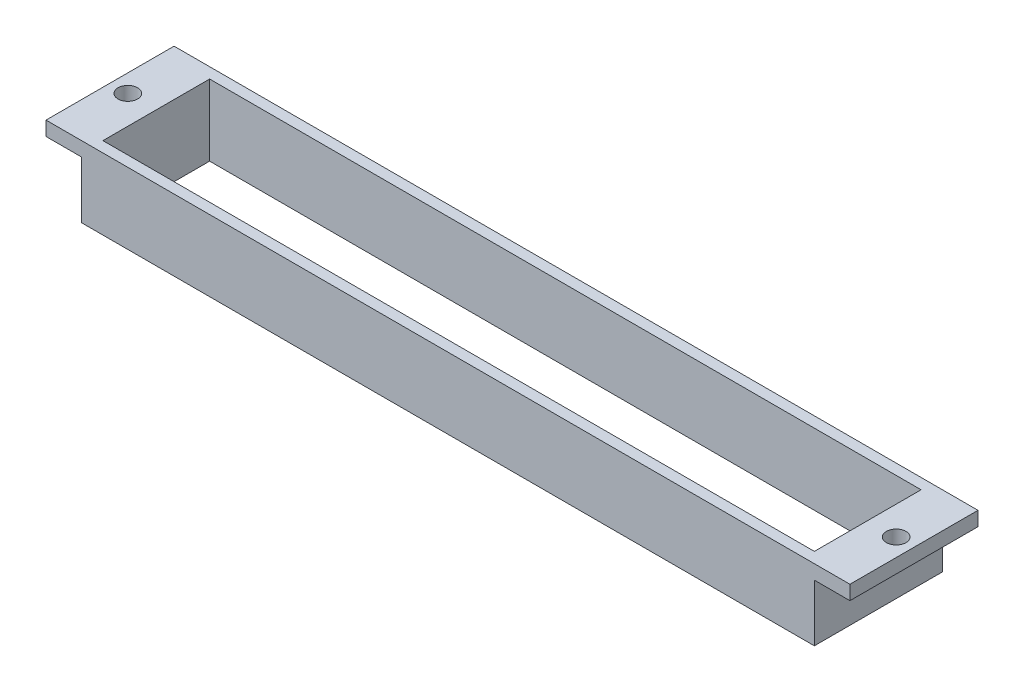
ISO-10303-21;
HEADER;
FILE_DESCRIPTION(('STEP AP214'),'2;1');
FILE_NAME('part.step','',(''),(''),'','','');
FILE_SCHEMA(('AUTOMOTIVE_DESIGN { 1 0 10303 214 1 1 1 1 }'));
ENDSEC;
DATA;
#1=APPLICATION_CONTEXT('core data for automotive mechanical design processes');
#2=APPLICATION_PROTOCOL_DEFINITION('international standard','automotive_design',2000,#1);
#3=PRODUCT_CONTEXT('',#1,'mechanical');
#4=PRODUCT('Part','Part','',(#3));
#5=PRODUCT_RELATED_PRODUCT_CATEGORY('part','',(#4));
#6=PRODUCT_DEFINITION_FORMATION('','',#4);
#7=PRODUCT_DEFINITION_CONTEXT('part definition',#1,'design');
#8=PRODUCT_DEFINITION('design','',#6,#7);
#9=PRODUCT_DEFINITION_SHAPE('','',#8);
#10=(LENGTH_UNIT() NAMED_UNIT(*) SI_UNIT(.MILLI.,.METRE.));
#11=(NAMED_UNIT(*) PLANE_ANGLE_UNIT() SI_UNIT($,.RADIAN.));
#12=(NAMED_UNIT(*) SI_UNIT($,.STERADIAN.) SOLID_ANGLE_UNIT());
#13=UNCERTAINTY_MEASURE_WITH_UNIT(LENGTH_MEASURE(1.E-05),#10,'distance_accuracy_value','');
#14=(GEOMETRIC_REPRESENTATION_CONTEXT(3) GLOBAL_UNCERTAINTY_ASSIGNED_CONTEXT((#13)) GLOBAL_UNIT_ASSIGNED_CONTEXT((#10,
#11,#12)) REPRESENTATION_CONTEXT('',''));
#15=CARTESIAN_POINT('',(0.,0.,0.));
#16=DIRECTION('',(0.,0.,1.));
#17=DIRECTION('',(1.,0.,0.));
#18=AXIS2_PLACEMENT_3D('',#15,#16,#17);
#19=CARTESIAN_POINT('',(0.,20.,0.));
#20=DIRECTION('',(0.,1.,0.));
#21=DIRECTION('',(0.,0.,1.));
#22=AXIS2_PLACEMENT_3D('',#19,#20,#21);
#23=PLANE('',#22);
#24=CARTESIAN_POINT('',(-108.,20.,0.));
#25=DIRECTION('',(0.,1.,0.));
#26=DIRECTION('',(0.,0.,1.));
#27=AXIS2_PLACEMENT_3D('',#24,#25,#26);
#28=CIRCLE('',#27,2.75000000000001);
#29=CARTESIAN_POINT('',(-108.,20.,2.75000000000001));
#30=VERTEX_POINT('',#29);
#31=EDGE_CURVE('E379',#30,#30,#28,.T.);
#32=ORIENTED_EDGE('',*,*,#31,.F.);
#33=EDGE_LOOP('',(#32));
#34=FACE_BOUND('',#33,.T.);
#35=CARTESIAN_POINT('',(108.,20.,0.));
#36=DIRECTION('',(0.,1.,0.));
#37=DIRECTION('',(0.,0.,1.));
#38=AXIS2_PLACEMENT_3D('',#35,#36,#37);
#39=CIRCLE('',#38,2.75000000000001);
#40=CARTESIAN_POINT('',(108.,20.,2.75000000000001));
#41=VERTEX_POINT('',#40);
#42=EDGE_CURVE('E151',#41,#41,#39,.T.);
#43=ORIENTED_EDGE('',*,*,#42,.F.);
#44=EDGE_LOOP('',(#43));
#45=FACE_BOUND('',#44,.T.);
#46=DIRECTION('',(-1.,0.,0.));
#47=VECTOR('',#46,1.);
#48=CARTESIAN_POINT('',(-103.,20.,-18.));
#49=LINE('',#48,#47);
#50=CARTESIAN_POINT('',(113.,20.,-18.));
#51=VERTEX_POINT('',#50);
#52=CARTESIAN_POINT('',(-113.,20.,-18.));
#53=VERTEX_POINT('',#52);
#54=EDGE_CURVE('E206',#51,#53,#49,.T.);
#55=ORIENTED_EDGE('',*,*,#54,.T.);
#56=DIRECTION('',(0.,0.,1.));
#57=VECTOR('',#56,1.);
#58=CARTESIAN_POINT('',(-113.,20.,-18.));
#59=LINE('',#58,#57);
#60=CARTESIAN_POINT('',(-113.,20.,18.));
#61=VERTEX_POINT('',#60);
#62=EDGE_CURVE('E146',#53,#61,#59,.T.);
#63=ORIENTED_EDGE('',*,*,#62,.T.);
#64=DIRECTION('',(1.,0.,0.));
#65=VECTOR('',#64,1.);
#66=CARTESIAN_POINT('',(-103.,20.,18.));
#67=LINE('',#66,#65);
#68=CARTESIAN_POINT('',(113.,20.,18.));
#69=VERTEX_POINT('',#68);
#70=EDGE_CURVE('E133',#61,#69,#67,.T.);
#71=ORIENTED_EDGE('',*,*,#70,.T.);
#72=DIRECTION('',(0.,0.,-1.));
#73=VECTOR('',#72,1.);
#74=CARTESIAN_POINT('',(113.,20.,-18.));
#75=LINE('',#74,#73);
#76=EDGE_CURVE('E156',#69,#51,#75,.T.);
#77=ORIENTED_EDGE('',*,*,#76,.T.);
#78=EDGE_LOOP('',(#55,#63,#71,#77));
#79=FACE_BOUND('',#78,.T.);
#80=DIRECTION('',(-1.,0.,0.));
#81=VECTOR('',#80,1.);
#82=CARTESIAN_POINT('',(-100.,20.,-15.));
#83=LINE('',#82,#81);
#84=CARTESIAN_POINT('',(100.,20.,-15.));
#85=VERTEX_POINT('',#84);
#86=CARTESIAN_POINT('',(-100.,20.,-15.));
#87=VERTEX_POINT('',#86);
#88=EDGE_CURVE('E176',#85,#87,#83,.T.);
#89=ORIENTED_EDGE('',*,*,#88,.F.);
#90=DIRECTION('',(0.,0.,-1.));
#91=VECTOR('',#90,1.);
#92=CARTESIAN_POINT('',(100.,20.,-15.));
#93=LINE('',#92,#91);
#94=CARTESIAN_POINT('',(100.,20.,15.));
#95=VERTEX_POINT('',#94);
#96=EDGE_CURVE('E174',#95,#85,#93,.T.);
#97=ORIENTED_EDGE('',*,*,#96,.F.);
#98=DIRECTION('',(1.,0.,0.));
#99=VECTOR('',#98,1.);
#100=CARTESIAN_POINT('',(-100.,20.,15.));
#101=LINE('',#100,#99);
#102=CARTESIAN_POINT('',(-100.,20.,15.));
#103=VERTEX_POINT('',#102);
#104=EDGE_CURVE('E182',#103,#95,#101,.T.);
#105=ORIENTED_EDGE('',*,*,#104,.F.);
#106=DIRECTION('',(0.,0.,1.));
#107=VECTOR('',#106,1.);
#108=CARTESIAN_POINT('',(-100.,20.,-15.));
#109=LINE('',#108,#107);
#110=EDGE_CURVE('E179',#87,#103,#109,.T.);
#111=ORIENTED_EDGE('',*,*,#110,.F.);
#112=EDGE_LOOP('',(#89,#97,#105,#111));
#113=FACE_BOUND('',#112,.T.);
#114=ADVANCED_FACE('F35',(#34,#45,#79,#113),#23,.T.);
#115=CARTESIAN_POINT('',(0.,0.,0.));
#116=DIRECTION('',(0.,1.,0.));
#117=DIRECTION('',(0.,0.,1.));
#118=AXIS2_PLACEMENT_3D('',#115,#116,#117);
#119=PLANE('',#118);
#120=DIRECTION('',(0.,0.,1.));
#121=VECTOR('',#120,1.);
#122=CARTESIAN_POINT('',(-103.,0.,-18.));
#123=LINE('',#122,#121);
#124=CARTESIAN_POINT('',(-103.,0.,-18.));
#125=VERTEX_POINT('',#124);
#126=CARTESIAN_POINT('',(-103.,0.,18.));
#127=VERTEX_POINT('',#126);
#128=EDGE_CURVE('E204',#125,#127,#123,.T.);
#129=ORIENTED_EDGE('',*,*,#128,.F.);
#130=DIRECTION('',(-1.,0.,0.));
#131=VECTOR('',#130,1.);
#132=CARTESIAN_POINT('',(-103.,0.,-18.));
#133=LINE('',#132,#131);
#134=CARTESIAN_POINT('',(103.,0.,-18.));
#135=VERTEX_POINT('',#134);
#136=EDGE_CURVE('E207',#135,#125,#133,.T.);
#137=ORIENTED_EDGE('',*,*,#136,.F.);
#138=DIRECTION('',(0.,0.,-1.));
#139=VECTOR('',#138,1.);
#140=CARTESIAN_POINT('',(103.,0.,-18.));
#141=LINE('',#140,#139);
#142=CARTESIAN_POINT('',(103.,0.,18.));
#143=VERTEX_POINT('',#142);
#144=EDGE_CURVE('E214',#143,#135,#141,.T.);
#145=ORIENTED_EDGE('',*,*,#144,.F.);
#146=DIRECTION('',(1.,0.,0.));
#147=VECTOR('',#146,1.);
#148=CARTESIAN_POINT('',(-103.,0.,18.));
#149=LINE('',#148,#147);
#150=EDGE_CURVE('E212',#127,#143,#149,.T.);
#151=ORIENTED_EDGE('',*,*,#150,.F.);
#152=EDGE_LOOP('',(#129,#137,#145,#151));
#153=FACE_BOUND('',#152,.T.);
#154=DIRECTION('',(0.,0.,-1.));
#155=VECTOR('',#154,1.);
#156=CARTESIAN_POINT('',(100.,0.,-15.));
#157=LINE('',#156,#155);
#158=CARTESIAN_POINT('',(100.,0.,15.));
#159=VERTEX_POINT('',#158);
#160=CARTESIAN_POINT('',(100.,0.,-15.));
#161=VERTEX_POINT('',#160);
#162=EDGE_CURVE('E172',#159,#161,#157,.T.);
#163=ORIENTED_EDGE('',*,*,#162,.T.);
#164=DIRECTION('',(-1.,0.,0.));
#165=VECTOR('',#164,1.);
#166=CARTESIAN_POINT('',(-100.,0.,-15.));
#167=LINE('',#166,#165);
#168=CARTESIAN_POINT('',(-100.,0.,-15.));
#169=VERTEX_POINT('',#168);
#170=EDGE_CURVE('E187',#161,#169,#167,.T.);
#171=ORIENTED_EDGE('',*,*,#170,.T.);
#172=DIRECTION('',(0.,0.,1.));
#173=VECTOR('',#172,1.);
#174=CARTESIAN_POINT('',(-100.,0.,-15.));
#175=LINE('',#174,#173);
#176=CARTESIAN_POINT('',(-100.,0.,15.));
#177=VERTEX_POINT('',#176);
#178=EDGE_CURVE('E190',#169,#177,#175,.T.);
#179=ORIENTED_EDGE('',*,*,#178,.T.);
#180=DIRECTION('',(1.,0.,0.));
#181=VECTOR('',#180,1.);
#182=CARTESIAN_POINT('',(-100.,0.,15.));
#183=LINE('',#182,#181);
#184=EDGE_CURVE('E177',#177,#159,#183,.T.);
#185=ORIENTED_EDGE('',*,*,#184,.T.);
#186=EDGE_LOOP('',(#163,#171,#179,#185));
#187=FACE_BOUND('',#186,.T.);
#188=ADVANCED_FACE('F230',(#153,#187),#119,.F.);
#189=CARTESIAN_POINT('',(-103.,20.,-18.));
#190=DIRECTION('',(1.,0.,0.));
#191=DIRECTION('',(0.,0.,-1.));
#192=AXIS2_PLACEMENT_3D('',#189,#190,#191);
#193=PLANE('',#192);
#194=DIRECTION('',(0.,-1.,0.));
#195=VECTOR('',#194,1.);
#196=CARTESIAN_POINT('',(-103.,20.,18.));
#197=LINE('',#196,#195);
#198=CARTESIAN_POINT('',(-103.,16.,18.));
#199=VERTEX_POINT('',#198);
#200=EDGE_CURVE('E11',#199,#127,#197,.T.);
#201=ORIENTED_EDGE('',*,*,#200,.F.);
#202=DIRECTION('',(0.,0.,-1.));
#203=VECTOR('',#202,1.);
#204=CARTESIAN_POINT('',(-103.,16.,-18.));
#205=LINE('',#204,#203);
#206=CARTESIAN_POINT('',(-103.,16.,-18.));
#207=VERTEX_POINT('',#206);
#208=EDGE_CURVE('E142',#199,#207,#205,.T.);
#209=ORIENTED_EDGE('',*,*,#208,.T.);
#210=DIRECTION('',(0.,-1.,0.));
#211=VECTOR('',#210,1.);
#212=CARTESIAN_POINT('',(-103.,20.,-18.));
#213=LINE('',#212,#211);
#214=EDGE_CURVE('E209',#207,#125,#213,.T.);
#215=ORIENTED_EDGE('',*,*,#214,.T.);
#216=ORIENTED_EDGE('',*,*,#128,.T.);
#217=EDGE_LOOP('',(#201,#209,#215,#216));
#218=FACE_BOUND('',#217,.T.);
#219=ADVANCED_FACE('F37',(#218),#193,.F.);
#220=CARTESIAN_POINT('',(-103.,20.,18.));
#221=DIRECTION('',(0.,0.,-1.));
#222=DIRECTION('',(-1.,0.,0.));
#223=AXIS2_PLACEMENT_3D('',#220,#221,#222);
#224=PLANE('',#223);
#225=ORIENTED_EDGE('',*,*,#150,.T.);
#226=DIRECTION('',(0.,-1.,0.));
#227=VECTOR('',#226,1.);
#228=CARTESIAN_POINT('',(103.,20.,18.));
#229=LINE('',#228,#227);
#230=CARTESIAN_POINT('',(103.,16.,18.));
#231=VERTEX_POINT('',#230);
#232=EDGE_CURVE('E43',#231,#143,#229,.T.);
#233=ORIENTED_EDGE('',*,*,#232,.F.);
#234=DIRECTION('',(1.,0.,0.));
#235=VECTOR('',#234,1.);
#236=CARTESIAN_POINT('',(103.,16.,18.));
#237=LINE('',#236,#235);
#238=CARTESIAN_POINT('',(113.,16.,18.));
#239=VERTEX_POINT('',#238);
#240=EDGE_CURVE('E58',#231,#239,#237,.T.);
#241=ORIENTED_EDGE('',*,*,#240,.T.);
#242=DIRECTION('',(0.,1.,0.));
#243=VECTOR('',#242,1.);
#244=CARTESIAN_POINT('',(113.,16.,18.));
#245=LINE('',#244,#243);
#246=EDGE_CURVE('E166',#239,#69,#245,.T.);
#247=ORIENTED_EDGE('',*,*,#246,.T.);
#248=ORIENTED_EDGE('',*,*,#70,.F.);
#249=DIRECTION('',(0.,1.,0.));
#250=VECTOR('',#249,1.);
#251=CARTESIAN_POINT('',(-113.,16.,18.));
#252=LINE('',#251,#250);
#253=CARTESIAN_POINT('',(-113.,16.,18.));
#254=VERTEX_POINT('',#253);
#255=EDGE_CURVE('E126',#254,#61,#252,.T.);
#256=ORIENTED_EDGE('',*,*,#255,.F.);
#257=DIRECTION('',(1.,0.,0.));
#258=VECTOR('',#257,1.);
#259=CARTESIAN_POINT('',(-113.,16.,18.));
#260=LINE('',#259,#258);
#261=EDGE_CURVE('E130',#254,#199,#260,.T.);
#262=ORIENTED_EDGE('',*,*,#261,.T.);
#263=ORIENTED_EDGE('',*,*,#200,.T.);
#264=EDGE_LOOP('',(#225,#233,#241,#247,#248,#256,#262,#263));
#265=FACE_BOUND('',#264,.T.);
#266=ADVANCED_FACE('F129',(#265),#224,.F.);
#267=CARTESIAN_POINT('',(103.,20.,-18.));
#268=DIRECTION('',(-1.,0.,0.));
#269=DIRECTION('',(0.,0.,1.));
#270=AXIS2_PLACEMENT_3D('',#267,#268,#269);
#271=PLANE('',#270);
#272=DIRECTION('',(0.,-1.,0.));
#273=VECTOR('',#272,1.);
#274=CARTESIAN_POINT('',(103.,20.,-18.));
#275=LINE('',#274,#273);
#276=CARTESIAN_POINT('',(103.,16.,-18.));
#277=VERTEX_POINT('',#276);
#278=EDGE_CURVE('E220',#277,#135,#275,.T.);
#279=ORIENTED_EDGE('',*,*,#278,.F.);
#280=DIRECTION('',(0.,0.,1.));
#281=VECTOR('',#280,1.);
#282=CARTESIAN_POINT('',(103.,16.,-18.));
#283=LINE('',#282,#281);
#284=EDGE_CURVE('E164',#277,#231,#283,.T.);
#285=ORIENTED_EDGE('',*,*,#284,.T.);
#286=ORIENTED_EDGE('',*,*,#232,.T.);
#287=ORIENTED_EDGE('',*,*,#144,.T.);
#288=EDGE_LOOP('',(#279,#285,#286,#287));
#289=FACE_BOUND('',#288,.T.);
#290=ADVANCED_FACE('F224',(#289),#271,.F.);
#291=CARTESIAN_POINT('',(-103.,20.,-18.));
#292=DIRECTION('',(0.,0.,1.));
#293=DIRECTION('',(1.,0.,0.));
#294=AXIS2_PLACEMENT_3D('',#291,#292,#293);
#295=PLANE('',#294);
#296=ORIENTED_EDGE('',*,*,#136,.T.);
#297=ORIENTED_EDGE('',*,*,#214,.F.);
#298=DIRECTION('',(-1.,0.,0.));
#299=VECTOR('',#298,1.);
#300=CARTESIAN_POINT('',(-113.,16.,-18.));
#301=LINE('',#300,#299);
#302=CARTESIAN_POINT('',(-113.,16.,-18.));
#303=VERTEX_POINT('',#302);
#304=EDGE_CURVE('E50',#207,#303,#301,.T.);
#305=ORIENTED_EDGE('',*,*,#304,.T.);
#306=DIRECTION('',(0.,1.,0.));
#307=VECTOR('',#306,1.);
#308=CARTESIAN_POINT('',(-113.,16.,-18.));
#309=LINE('',#308,#307);
#310=EDGE_CURVE('E138',#303,#53,#309,.T.);
#311=ORIENTED_EDGE('',*,*,#310,.T.);
#312=ORIENTED_EDGE('',*,*,#54,.F.);
#313=DIRECTION('',(0.,1.,0.));
#314=VECTOR('',#313,1.);
#315=CARTESIAN_POINT('',(113.,16.,-18.));
#316=LINE('',#315,#314);
#317=CARTESIAN_POINT('',(113.,16.,-18.));
#318=VERTEX_POINT('',#317);
#319=EDGE_CURVE('E169',#318,#51,#316,.T.);
#320=ORIENTED_EDGE('',*,*,#319,.F.);
#321=DIRECTION('',(-1.,0.,0.));
#322=VECTOR('',#321,1.);
#323=CARTESIAN_POINT('',(103.,16.,-18.));
#324=LINE('',#323,#322);
#325=EDGE_CURVE('E162',#318,#277,#324,.T.);
#326=ORIENTED_EDGE('',*,*,#325,.T.);
#327=ORIENTED_EDGE('',*,*,#278,.T.);
#328=EDGE_LOOP('',(#296,#297,#305,#311,#312,#320,#326,#327));
#329=FACE_BOUND('',#328,.T.);
#330=ADVANCED_FACE('F234',(#329),#295,.F.);
#331=CARTESIAN_POINT('',(100.,20.,-15.));
#332=DIRECTION('',(-1.,0.,0.));
#333=DIRECTION('',(0.,0.,1.));
#334=AXIS2_PLACEMENT_3D('',#331,#332,#333);
#335=PLANE('',#334);
#336=ORIENTED_EDGE('',*,*,#162,.F.);
#337=DIRECTION('',(0.,-1.,0.));
#338=VECTOR('',#337,1.);
#339=CARTESIAN_POINT('',(100.,20.,15.));
#340=LINE('',#339,#338);
#341=EDGE_CURVE('E184',#95,#159,#340,.T.);
#342=ORIENTED_EDGE('',*,*,#341,.F.);
#343=ORIENTED_EDGE('',*,*,#96,.T.);
#344=DIRECTION('',(0.,-1.,0.));
#345=VECTOR('',#344,1.);
#346=CARTESIAN_POINT('',(100.,20.,-15.));
#347=LINE('',#346,#345);
#348=EDGE_CURVE('E201',#85,#161,#347,.T.);
#349=ORIENTED_EDGE('',*,*,#348,.T.);
#350=EDGE_LOOP('',(#336,#342,#343,#349));
#351=FACE_BOUND('',#350,.T.);
#352=ADVANCED_FACE('F260',(#351),#335,.T.);
#353=CARTESIAN_POINT('',(-100.,20.,-15.));
#354=DIRECTION('',(0.,0.,1.));
#355=DIRECTION('',(1.,0.,0.));
#356=AXIS2_PLACEMENT_3D('',#353,#354,#355);
#357=PLANE('',#356);
#358=ORIENTED_EDGE('',*,*,#170,.F.);
#359=ORIENTED_EDGE('',*,*,#348,.F.);
#360=ORIENTED_EDGE('',*,*,#88,.T.);
#361=DIRECTION('',(0.,-1.,0.));
#362=VECTOR('',#361,1.);
#363=CARTESIAN_POINT('',(-100.,20.,-15.));
#364=LINE('',#363,#362);
#365=EDGE_CURVE('E199',#87,#169,#364,.T.);
#366=ORIENTED_EDGE('',*,*,#365,.T.);
#367=EDGE_LOOP('',(#358,#359,#360,#366));
#368=FACE_BOUND('',#367,.T.);
#369=ADVANCED_FACE('F288',(#368),#357,.T.);
#370=CARTESIAN_POINT('',(-100.,20.,-15.));
#371=DIRECTION('',(1.,0.,0.));
#372=DIRECTION('',(0.,0.,-1.));
#373=AXIS2_PLACEMENT_3D('',#370,#371,#372);
#374=PLANE('',#373);
#375=ORIENTED_EDGE('',*,*,#178,.F.);
#376=ORIENTED_EDGE('',*,*,#365,.F.);
#377=ORIENTED_EDGE('',*,*,#110,.T.);
#378=DIRECTION('',(0.,-1.,0.));
#379=VECTOR('',#378,1.);
#380=CARTESIAN_POINT('',(-100.,20.,15.));
#381=LINE('',#380,#379);
#382=EDGE_CURVE('E197',#103,#177,#381,.T.);
#383=ORIENTED_EDGE('',*,*,#382,.T.);
#384=EDGE_LOOP('',(#375,#376,#377,#383));
#385=FACE_BOUND('',#384,.T.);
#386=ADVANCED_FACE('F298',(#385),#374,.T.);
#387=CARTESIAN_POINT('',(-100.,20.,15.));
#388=DIRECTION('',(0.,0.,-1.));
#389=DIRECTION('',(-1.,0.,0.));
#390=AXIS2_PLACEMENT_3D('',#387,#388,#389);
#391=PLANE('',#390);
#392=ORIENTED_EDGE('',*,*,#184,.F.);
#393=ORIENTED_EDGE('',*,*,#382,.F.);
#394=ORIENTED_EDGE('',*,*,#104,.T.);
#395=ORIENTED_EDGE('',*,*,#341,.T.);
#396=EDGE_LOOP('',(#392,#393,#394,#395));
#397=FACE_BOUND('',#396,.T.);
#398=ADVANCED_FACE('F246',(#397),#391,.T.);
#399=CARTESIAN_POINT('',(113.,16.,-18.));
#400=DIRECTION('',(1.,0.,0.));
#401=DIRECTION('',(0.,0.,-1.));
#402=AXIS2_PLACEMENT_3D('',#399,#400,#401);
#403=PLANE('',#402);
#404=ORIENTED_EDGE('',*,*,#76,.F.);
#405=ORIENTED_EDGE('',*,*,#246,.F.);
#406=DIRECTION('',(0.,0.,-1.));
#407=VECTOR('',#406,1.);
#408=CARTESIAN_POINT('',(113.,16.,-18.));
#409=LINE('',#408,#407);
#410=EDGE_CURVE('E159',#239,#318,#409,.T.);
#411=ORIENTED_EDGE('',*,*,#410,.T.);
#412=ORIENTED_EDGE('',*,*,#319,.T.);
#413=EDGE_LOOP('',(#404,#405,#411,#412));
#414=FACE_BOUND('',#413,.T.);
#415=ADVANCED_FACE('F238',(#414),#403,.T.);
#416=CARTESIAN_POINT('',(0.,16.,0.));
#417=DIRECTION('',(0.,-1.,0.));
#418=DIRECTION('',(0.,0.,-1.));
#419=AXIS2_PLACEMENT_3D('',#416,#417,#418);
#420=PLANE('',#419);
#421=CARTESIAN_POINT('',(108.,16.,0.));
#422=DIRECTION('',(0.,1.,0.));
#423=DIRECTION('',(0.,0.,1.));
#424=AXIS2_PLACEMENT_3D('',#421,#422,#423);
#425=CIRCLE('',#424,2.75000000000001);
#426=CARTESIAN_POINT('',(108.,16.,2.75000000000001));
#427=VERTEX_POINT('',#426);
#428=EDGE_CURVE('E148',#427,#427,#425,.T.);
#429=ORIENTED_EDGE('',*,*,#428,.T.);
#430=EDGE_LOOP('',(#429));
#431=FACE_BOUND('',#430,.T.);
#432=ORIENTED_EDGE('',*,*,#240,.F.);
#433=ORIENTED_EDGE('',*,*,#284,.F.);
#434=ORIENTED_EDGE('',*,*,#325,.F.);
#435=ORIENTED_EDGE('',*,*,#410,.F.);
#436=EDGE_LOOP('',(#432,#433,#434,#435));
#437=FACE_BOUND('',#436,.T.);
#438=ADVANCED_FACE('F236',(#431,#437),#420,.T.);
#439=CARTESIAN_POINT('',(-113.,16.,-18.));
#440=DIRECTION('',(-1.,0.,0.));
#441=DIRECTION('',(0.,0.,1.));
#442=AXIS2_PLACEMENT_3D('',#439,#440,#441);
#443=PLANE('',#442);
#444=ORIENTED_EDGE('',*,*,#62,.F.);
#445=ORIENTED_EDGE('',*,*,#310,.F.);
#446=DIRECTION('',(0.,0.,1.));
#447=VECTOR('',#446,1.);
#448=CARTESIAN_POINT('',(-113.,16.,-18.));
#449=LINE('',#448,#447);
#450=EDGE_CURVE('E141',#303,#254,#449,.T.);
#451=ORIENTED_EDGE('',*,*,#450,.T.);
#452=ORIENTED_EDGE('',*,*,#255,.T.);
#453=EDGE_LOOP('',(#444,#445,#451,#452));
#454=FACE_BOUND('',#453,.T.);
#455=ADVANCED_FACE('F144',(#454),#443,.T.);
#456=CARTESIAN_POINT('',(0.,16.,0.));
#457=DIRECTION('',(0.,1.,0.));
#458=DIRECTION('',(0.,0.,1.));
#459=AXIS2_PLACEMENT_3D('',#456,#457,#458);
#460=PLANE('',#459);
#461=CARTESIAN_POINT('',(-108.,16.,0.));
#462=DIRECTION('',(0.,1.,0.));
#463=DIRECTION('',(0.,0.,1.));
#464=AXIS2_PLACEMENT_3D('',#461,#462,#463);
#465=CIRCLE('',#464,2.75000000000001);
#466=CARTESIAN_POINT('',(-108.,16.,2.75000000000001));
#467=VERTEX_POINT('',#466);
#468=EDGE_CURVE('E377',#467,#467,#465,.T.);
#469=ORIENTED_EDGE('',*,*,#468,.T.);
#470=EDGE_LOOP('',(#469));
#471=FACE_BOUND('',#470,.T.);
#472=ORIENTED_EDGE('',*,*,#450,.F.);
#473=ORIENTED_EDGE('',*,*,#304,.F.);
#474=ORIENTED_EDGE('',*,*,#208,.F.);
#475=ORIENTED_EDGE('',*,*,#261,.F.);
#476=EDGE_LOOP('',(#472,#473,#474,#475));
#477=FACE_BOUND('',#476,.T.);
#478=ADVANCED_FACE('F140',(#471,#477),#460,.F.);
#479=CARTESIAN_POINT('',(108.,16.,0.));
#480=DIRECTION('',(0.,1.,0.));
#481=DIRECTION('',(0.,0.,1.));
#482=AXIS2_PLACEMENT_3D('',#479,#480,#481);
#483=CYLINDRICAL_SURFACE('',#482,2.75000000000001);
#484=ORIENTED_EDGE('',*,*,#428,.F.);
#485=EDGE_LOOP('',(#484));
#486=FACE_BOUND('',#485,.T.);
#487=ORIENTED_EDGE('',*,*,#42,.T.);
#488=EDGE_LOOP('',(#487));
#489=FACE_BOUND('',#488,.T.);
#490=ADVANCED_FACE('F350',(#486,#489),#483,.F.);
#491=CARTESIAN_POINT('',(-108.,16.,0.));
#492=DIRECTION('',(0.,1.,0.));
#493=DIRECTION('',(0.,0.,1.));
#494=AXIS2_PLACEMENT_3D('',#491,#492,#493);
#495=CYLINDRICAL_SURFACE('',#494,2.75000000000001);
#496=ORIENTED_EDGE('',*,*,#468,.F.);
#497=EDGE_LOOP('',(#496));
#498=FACE_BOUND('',#497,.T.);
#499=ORIENTED_EDGE('',*,*,#31,.T.);
#500=EDGE_LOOP('',(#499));
#501=FACE_BOUND('',#500,.T.);
#502=ADVANCED_FACE('F360',(#498,#501),#495,.F.);
#503=CLOSED_SHELL('',(#114,#188,#219,#266,#290,#330,#352,#369,#386,#398,#415,#438,#455,#478,
#490,#502));
#504=MANIFOLD_SOLID_BREP('B2',#503);
#505=ADVANCED_BREP_SHAPE_REPRESENTATION('',(#18,#504),#14);
#506=SHAPE_DEFINITION_REPRESENTATION(#9,#505);
ENDSEC;
END-ISO-10303-21;
